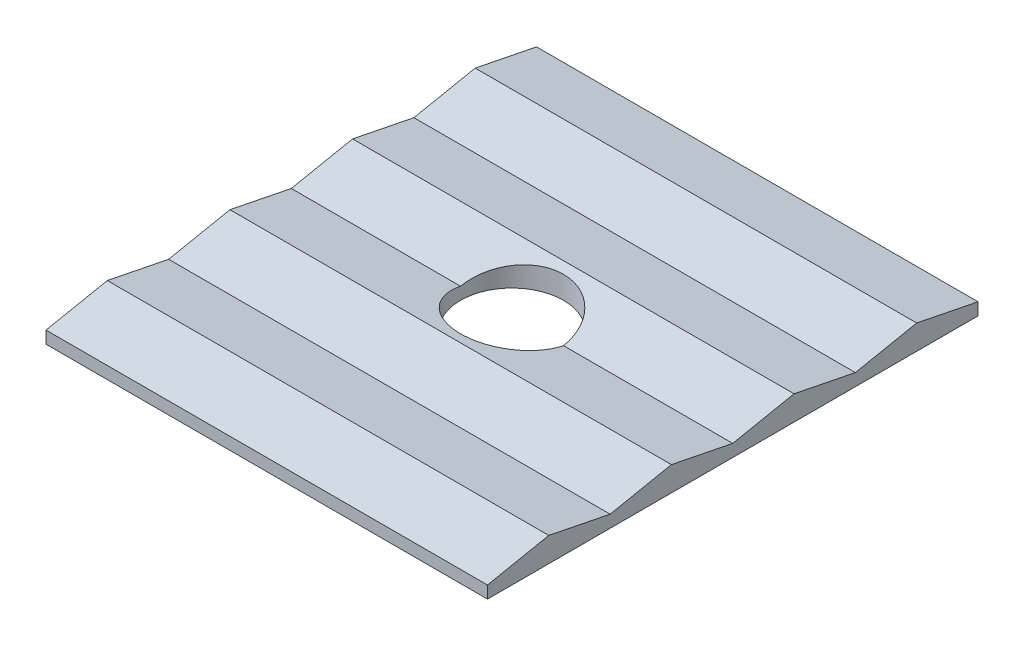
ISO-10303-21;
HEADER;
FILE_DESCRIPTION(('STEP AP214'),'2;1');
FILE_NAME('part.step','',(''),(''),'','','');
FILE_SCHEMA(('AUTOMOTIVE_DESIGN { 1 0 10303 214 1 1 1 1 }'));
ENDSEC;
DATA;
#1=APPLICATION_CONTEXT('core data for automotive mechanical design processes');
#2=APPLICATION_PROTOCOL_DEFINITION('international standard','automotive_design',2000,#1);
#3=PRODUCT_CONTEXT('',#1,'mechanical');
#4=PRODUCT('Part','Part','',(#3));
#5=PRODUCT_RELATED_PRODUCT_CATEGORY('part','',(#4));
#6=PRODUCT_DEFINITION_FORMATION('','',#4);
#7=PRODUCT_DEFINITION_CONTEXT('part definition',#1,'design');
#8=PRODUCT_DEFINITION('design','',#6,#7);
#9=PRODUCT_DEFINITION_SHAPE('','',#8);
#10=(LENGTH_UNIT() NAMED_UNIT(*) SI_UNIT(.MILLI.,.METRE.));
#11=(NAMED_UNIT(*) PLANE_ANGLE_UNIT() SI_UNIT($,.RADIAN.));
#12=(NAMED_UNIT(*) SI_UNIT($,.STERADIAN.) SOLID_ANGLE_UNIT());
#13=UNCERTAINTY_MEASURE_WITH_UNIT(LENGTH_MEASURE(1.E-05),#10,'distance_accuracy_value','');
#14=(GEOMETRIC_REPRESENTATION_CONTEXT(3) GLOBAL_UNCERTAINTY_ASSIGNED_CONTEXT((#13)) GLOBAL_UNIT_ASSIGNED_CONTEXT((#10,
#11,#12)) REPRESENTATION_CONTEXT('',''));
#15=CARTESIAN_POINT('',(0.,0.,0.));
#16=DIRECTION('',(0.,0.,1.));
#17=DIRECTION('',(1.,0.,0.));
#18=AXIS2_PLACEMENT_3D('',#15,#16,#17);
#19=CARTESIAN_POINT('',(22.86,0.,0.));
#20=DIRECTION('',(0.,0.,-1.));
#21=DIRECTION('',(-1.,0.,0.));
#22=AXIS2_PLACEMENT_3D('',#19,#20,#21);
#23=PLANE('',#22);
#24=DIRECTION('',(0.,-1.,0.));
#25=VECTOR('',#24,1.);
#26=CARTESIAN_POINT('',(0.,0.,0.));
#27=LINE('',#26,#25);
#28=CARTESIAN_POINT('',(0.,0.635,0.));
#29=VERTEX_POINT('',#28);
#30=CARTESIAN_POINT('',(0.,0.,0.));
#31=VERTEX_POINT('',#30);
#32=EDGE_CURVE('E174',#29,#31,#27,.T.);
#33=ORIENTED_EDGE('',*,*,#32,.T.);
#34=DIRECTION('',(-1.,0.,0.));
#35=VECTOR('',#34,1.);
#36=CARTESIAN_POINT('',(22.86,0.,0.));
#37=LINE('',#36,#35);
#38=CARTESIAN_POINT('',(22.86,0.,0.));
#39=VERTEX_POINT('',#38);
#40=EDGE_CURVE('E52',#39,#31,#37,.T.);
#41=ORIENTED_EDGE('',*,*,#40,.F.);
#42=DIRECTION('',(0.,-1.,0.));
#43=VECTOR('',#42,1.);
#44=CARTESIAN_POINT('',(22.86,0.,0.));
#45=LINE('',#44,#43);
#46=CARTESIAN_POINT('',(22.86,0.635,0.));
#47=VERTEX_POINT('',#46);
#48=EDGE_CURVE('E206',#47,#39,#45,.T.);
#49=ORIENTED_EDGE('',*,*,#48,.F.);
#50=DIRECTION('',(-1.,0.,0.));
#51=VECTOR('',#50,1.);
#52=CARTESIAN_POINT('',(22.86,0.635,0.));
#53=LINE('',#52,#51);
#54=EDGE_CURVE('E166',#47,#29,#53,.T.);
#55=ORIENTED_EDGE('',*,*,#54,.T.);
#56=EDGE_LOOP('',(#33,#41,#49,#55));
#57=FACE_BOUND('',#56,.T.);
#58=ADVANCED_FACE('F44',(#57),#23,.F.);
#59=CARTESIAN_POINT('',(22.86,0.,0.));
#60=DIRECTION('',(0.,1.,0.));
#61=DIRECTION('',(0.,0.,1.));
#62=AXIS2_PLACEMENT_3D('',#59,#60,#61);
#63=PLANE('',#62);
#64=CARTESIAN_POINT('',(11.43,0.,-12.7));
#65=DIRECTION('',(0.,-1.,0.));
#66=DIRECTION('',(0.,0.,-1.));
#67=AXIS2_PLACEMENT_3D('',#64,#65,#66);
#68=CIRCLE('',#67,2.667);
#69=CARTESIAN_POINT('',(11.43,0.,-15.367));
#70=VERTEX_POINT('',#69);
#71=EDGE_CURVE('E295',#70,#70,#68,.T.);
#72=ORIENTED_EDGE('',*,*,#71,.F.);
#73=EDGE_LOOP('',(#72));
#74=FACE_BOUND('',#73,.T.);
#75=DIRECTION('',(0.,0.,-1.));
#76=VECTOR('',#75,1.);
#77=CARTESIAN_POINT('',(0.,0.,0.));
#78=LINE('',#77,#76);
#79=CARTESIAN_POINT('',(0.,0.,-25.4));
#80=VERTEX_POINT('',#79);
#81=EDGE_CURVE('E179',#31,#80,#78,.T.);
#82=ORIENTED_EDGE('',*,*,#81,.T.);
#83=DIRECTION('',(-1.,0.,0.));
#84=VECTOR('',#83,1.);
#85=CARTESIAN_POINT('',(22.86,0.,-25.4));
#86=LINE('',#85,#84);
#87=CARTESIAN_POINT('',(22.86,0.,-25.4));
#88=VERTEX_POINT('',#87);
#89=EDGE_CURVE('E235',#88,#80,#86,.T.);
#90=ORIENTED_EDGE('',*,*,#89,.F.);
#91=DIRECTION('',(0.,0.,-1.));
#92=VECTOR('',#91,1.);
#93=CARTESIAN_POINT('',(22.86,0.,0.));
#94=LINE('',#93,#92);
#95=EDGE_CURVE('E119',#39,#88,#94,.T.);
#96=ORIENTED_EDGE('',*,*,#95,.F.);
#97=ORIENTED_EDGE('',*,*,#40,.T.);
#98=EDGE_LOOP('',(#82,#90,#96,#97));
#99=FACE_BOUND('',#98,.T.);
#100=ADVANCED_FACE('F239',(#74,#99),#63,.F.);
#101=CARTESIAN_POINT('',(22.86,0.,-25.4));
#102=DIRECTION('',(0.,0.,1.));
#103=DIRECTION('',(1.,0.,0.));
#104=AXIS2_PLACEMENT_3D('',#101,#102,#103);
#105=PLANE('',#104);
#106=DIRECTION('',(0.,1.,0.));
#107=VECTOR('',#106,1.);
#108=CARTESIAN_POINT('',(0.,0.,-25.4));
#109=LINE('',#108,#107);
#110=CARTESIAN_POINT('',(0.,0.635,-25.4));
#111=VERTEX_POINT('',#110);
#112=EDGE_CURVE('E176',#80,#111,#109,.T.);
#113=ORIENTED_EDGE('',*,*,#112,.T.);
#114=DIRECTION('',(-1.,0.,0.));
#115=VECTOR('',#114,1.);
#116=CARTESIAN_POINT('',(22.86,0.635,-25.4));
#117=LINE('',#116,#115);
#118=CARTESIAN_POINT('',(22.86,0.635,-25.4));
#119=VERTEX_POINT('',#118);
#120=EDGE_CURVE('E228',#119,#111,#117,.T.);
#121=ORIENTED_EDGE('',*,*,#120,.F.);
#122=DIRECTION('',(0.,1.,0.));
#123=VECTOR('',#122,1.);
#124=CARTESIAN_POINT('',(22.86,0.,-25.4));
#125=LINE('',#124,#123);
#126=EDGE_CURVE('E257',#88,#119,#125,.T.);
#127=ORIENTED_EDGE('',*,*,#126,.F.);
#128=ORIENTED_EDGE('',*,*,#89,.T.);
#129=EDGE_LOOP('',(#113,#121,#127,#128));
#130=FACE_BOUND('',#129,.T.);
#131=ADVANCED_FACE('F246',(#130),#105,.F.);
#132=CARTESIAN_POINT('',(22.86,1.27,-22.225));
#133=DIRECTION('',(0.,-0.98058067569092,0.196116135138184));
#134=DIRECTION('',(0.,-0.196116135138184,-0.98058067569092));
#135=AXIS2_PLACEMENT_3D('',#132,#133,#134);
#136=PLANE('',#135);
#137=DIRECTION('',(0.,0.196116135138184,0.98058067569092));
#138=VECTOR('',#137,1.);
#139=CARTESIAN_POINT('',(0.,1.27,-22.225));
#140=LINE('',#139,#138);
#141=CARTESIAN_POINT('',(0.,1.27,-22.225));
#142=VERTEX_POINT('',#141);
#143=EDGE_CURVE('E181',#111,#142,#140,.T.);
#144=ORIENTED_EDGE('',*,*,#143,.T.);
#145=DIRECTION('',(-1.,0.,0.));
#146=VECTOR('',#145,1.);
#147=CARTESIAN_POINT('',(22.86,1.27,-22.225));
#148=LINE('',#147,#146);
#149=CARTESIAN_POINT('',(22.86,1.27,-22.225));
#150=VERTEX_POINT('',#149);
#151=EDGE_CURVE('E227',#150,#142,#148,.T.);
#152=ORIENTED_EDGE('',*,*,#151,.F.);
#153=DIRECTION('',(0.,0.196116135138184,0.98058067569092));
#154=VECTOR('',#153,1.);
#155=CARTESIAN_POINT('',(22.86,1.27,-22.225));
#156=LINE('',#155,#154);
#157=EDGE_CURVE('E258',#119,#150,#156,.T.);
#158=ORIENTED_EDGE('',*,*,#157,.F.);
#159=ORIENTED_EDGE('',*,*,#120,.T.);
#160=EDGE_LOOP('',(#144,#152,#158,#159));
#161=FACE_BOUND('',#160,.T.);
#162=ADVANCED_FACE('F255',(#161),#136,.F.);
#163=CARTESIAN_POINT('',(22.86,0.635,-19.05));
#164=DIRECTION('',(0.,-0.98058067569092,-0.196116135138184));
#165=DIRECTION('',(0.,0.196116135138184,-0.98058067569092));
#166=AXIS2_PLACEMENT_3D('',#163,#164,#165);
#167=PLANE('',#166);
#168=DIRECTION('',(0.,-0.196116135138184,0.98058067569092));
#169=VECTOR('',#168,1.);
#170=CARTESIAN_POINT('',(0.,0.635,-19.05));
#171=LINE('',#170,#169);
#172=CARTESIAN_POINT('',(0.,0.635,-19.05));
#173=VERTEX_POINT('',#172);
#174=EDGE_CURVE('E187',#142,#173,#171,.T.);
#175=ORIENTED_EDGE('',*,*,#174,.T.);
#176=DIRECTION('',(-1.,0.,0.));
#177=VECTOR('',#176,1.);
#178=CARTESIAN_POINT('',(22.86,0.635,-19.05));
#179=LINE('',#178,#177);
#180=CARTESIAN_POINT('',(22.86,0.635,-19.05));
#181=VERTEX_POINT('',#180);
#182=EDGE_CURVE('E225',#181,#173,#179,.T.);
#183=ORIENTED_EDGE('',*,*,#182,.F.);
#184=DIRECTION('',(0.,-0.196116135138184,0.98058067569092));
#185=VECTOR('',#184,1.);
#186=CARTESIAN_POINT('',(22.86,0.635,-19.05));
#187=LINE('',#186,#185);
#188=EDGE_CURVE('E259',#150,#181,#187,.T.);
#189=ORIENTED_EDGE('',*,*,#188,.F.);
#190=ORIENTED_EDGE('',*,*,#151,.T.);
#191=EDGE_LOOP('',(#175,#183,#189,#190));
#192=FACE_BOUND('',#191,.T.);
#193=ADVANCED_FACE('F309',(#192),#167,.F.);
#194=CARTESIAN_POINT('',(22.86,1.27,-15.875));
#195=DIRECTION('',(0.,-0.98058067569092,0.196116135138184));
#196=DIRECTION('',(0.,-0.196116135138184,-0.98058067569092));
#197=AXIS2_PLACEMENT_3D('',#194,#195,#196);
#198=PLANE('',#197);
#199=DIRECTION('',(0.,0.196116135138184,0.98058067569092));
#200=VECTOR('',#199,1.);
#201=CARTESIAN_POINT('',(0.,1.27,-15.875));
#202=LINE('',#201,#200);
#203=CARTESIAN_POINT('',(0.,1.27,-15.875));
#204=VERTEX_POINT('',#203);
#205=EDGE_CURVE('E186',#173,#204,#202,.T.);
#206=ORIENTED_EDGE('',*,*,#205,.T.);
#207=DIRECTION('',(-1.,0.,0.));
#208=VECTOR('',#207,1.);
#209=CARTESIAN_POINT('',(22.86,1.27,-15.875));
#210=LINE('',#209,#208);
#211=CARTESIAN_POINT('',(22.86,1.27,-15.875));
#212=VERTEX_POINT('',#211);
#213=EDGE_CURVE('E217',#212,#204,#210,.T.);
#214=ORIENTED_EDGE('',*,*,#213,.F.);
#215=DIRECTION('',(0.,0.196116135138184,0.98058067569092));
#216=VECTOR('',#215,1.);
#217=CARTESIAN_POINT('',(22.86,1.27,-15.875));
#218=LINE('',#217,#216);
#219=EDGE_CURVE('E262',#181,#212,#218,.T.);
#220=ORIENTED_EDGE('',*,*,#219,.F.);
#221=ORIENTED_EDGE('',*,*,#182,.T.);
#222=EDGE_LOOP('',(#206,#214,#220,#221));
#223=FACE_BOUND('',#222,.T.);
#224=ADVANCED_FACE('F311',(#223),#198,.F.);
#225=CARTESIAN_POINT('',(22.86,0.635,-12.7));
#226=DIRECTION('',(0.,-0.98058067569092,-0.196116135138184));
#227=DIRECTION('',(0.,0.196116135138184,-0.98058067569092));
#228=AXIS2_PLACEMENT_3D('',#225,#226,#227);
#229=PLANE('',#228);
#230=DIRECTION('',(-1.,0.,0.));
#231=VECTOR('',#230,1.);
#232=CARTESIAN_POINT('',(22.86,0.635,-12.7));
#233=LINE('',#232,#231);
#234=CARTESIAN_POINT('',(8.76300000000001,0.635,-12.7));
#235=VERTEX_POINT('',#234);
#236=CARTESIAN_POINT('',(0.,0.635,-12.7));
#237=VERTEX_POINT('',#236);
#238=EDGE_CURVE('E213',#235,#237,#233,.T.);
#239=ORIENTED_EDGE('',*,*,#238,.F.);
#240=CARTESIAN_POINT('',(11.43,0.635,-12.7));
#241=DIRECTION('',(0.,-0.98058067569092,-0.196116135138184));
#242=DIRECTION('',(0.,-0.196116135138184,0.98058067569092));
#243=AXIS2_PLACEMENT_3D('',#240,#241,#242);
#244=ELLIPSE('',#243,2.71981700855039,2.667);
#245=CARTESIAN_POINT('',(14.097,0.635,-12.7));
#246=VERTEX_POINT('',#245);
#247=EDGE_CURVE('E56',#235,#246,#244,.T.);
#248=ORIENTED_EDGE('',*,*,#247,.T.);
#249=CARTESIAN_POINT('',(22.86,0.635,-12.7));
#250=VERTEX_POINT('',#249);
#251=EDGE_CURVE('E212',#250,#246,#233,.T.);
#252=ORIENTED_EDGE('',*,*,#251,.F.);
#253=DIRECTION('',(0.,-0.196116135138184,0.98058067569092));
#254=VECTOR('',#253,1.);
#255=CARTESIAN_POINT('',(22.86,0.635,-12.7));
#256=LINE('',#255,#254);
#257=EDGE_CURVE('E271',#212,#250,#256,.T.);
#258=ORIENTED_EDGE('',*,*,#257,.F.);
#259=ORIENTED_EDGE('',*,*,#213,.T.);
#260=DIRECTION('',(0.,-0.196116135138184,0.98058067569092));
#261=VECTOR('',#260,1.);
#262=CARTESIAN_POINT('',(0.,0.635,-12.7));
#263=LINE('',#262,#261);
#264=EDGE_CURVE('E194',#204,#237,#263,.T.);
#265=ORIENTED_EDGE('',*,*,#264,.T.);
#266=EDGE_LOOP('',(#239,#248,#252,#258,#259,#265));
#267=FACE_BOUND('',#266,.T.);
#268=ADVANCED_FACE('F278',(#267),#229,.F.);
#269=CARTESIAN_POINT('',(22.86,1.27,-9.525));
#270=DIRECTION('',(0.,-0.98058067569092,0.196116135138184));
#271=DIRECTION('',(0.,-0.196116135138184,-0.98058067569092));
#272=AXIS2_PLACEMENT_3D('',#269,#270,#271);
#273=PLANE('',#272);
#274=ORIENTED_EDGE('',*,*,#251,.T.);
#275=CARTESIAN_POINT('',(11.43,0.635,-12.7));
#276=DIRECTION('',(0.,-0.98058067569092,0.196116135138184));
#277=DIRECTION('',(0.,-0.196116135138184,-0.98058067569092));
#278=AXIS2_PLACEMENT_3D('',#275,#276,#277);
#279=ELLIPSE('',#278,2.71981700855039,2.667);
#280=EDGE_CURVE('E11',#246,#235,#279,.T.);
#281=ORIENTED_EDGE('',*,*,#280,.T.);
#282=ORIENTED_EDGE('',*,*,#238,.T.);
#283=DIRECTION('',(0.,0.196116135138184,0.98058067569092));
#284=VECTOR('',#283,1.);
#285=CARTESIAN_POINT('',(0.,1.27,-9.525));
#286=LINE('',#285,#284);
#287=CARTESIAN_POINT('',(0.,1.27,-9.525));
#288=VERTEX_POINT('',#287);
#289=EDGE_CURVE('E198',#237,#288,#286,.T.);
#290=ORIENTED_EDGE('',*,*,#289,.T.);
#291=DIRECTION('',(-1.,0.,0.));
#292=VECTOR('',#291,1.);
#293=CARTESIAN_POINT('',(22.86,1.27,-9.525));
#294=LINE('',#293,#292);
#295=CARTESIAN_POINT('',(22.86,1.27,-9.525));
#296=VERTEX_POINT('',#295);
#297=EDGE_CURVE('E165',#296,#288,#294,.T.);
#298=ORIENTED_EDGE('',*,*,#297,.F.);
#299=DIRECTION('',(0.,0.196116135138184,0.98058067569092));
#300=VECTOR('',#299,1.);
#301=CARTESIAN_POINT('',(22.86,1.27,-9.525));
#302=LINE('',#301,#300);
#303=EDGE_CURVE('E146',#250,#296,#302,.T.);
#304=ORIENTED_EDGE('',*,*,#303,.F.);
#305=EDGE_LOOP('',(#274,#281,#282,#290,#298,#304));
#306=FACE_BOUND('',#305,.T.);
#307=ADVANCED_FACE('F285',(#306),#273,.F.);
#308=CARTESIAN_POINT('',(22.86,0.635,-6.35));
#309=DIRECTION('',(0.,-0.98058067569092,-0.196116135138184));
#310=DIRECTION('',(0.,0.196116135138184,-0.98058067569092));
#311=AXIS2_PLACEMENT_3D('',#308,#309,#310);
#312=PLANE('',#311);
#313=DIRECTION('',(0.,-0.196116135138184,0.98058067569092));
#314=VECTOR('',#313,1.);
#315=CARTESIAN_POINT('',(0.,0.635,-6.35));
#316=LINE('',#315,#314);
#317=CARTESIAN_POINT('',(0.,0.635,-6.35));
#318=VERTEX_POINT('',#317);
#319=EDGE_CURVE('E158',#288,#318,#316,.T.);
#320=ORIENTED_EDGE('',*,*,#319,.T.);
#321=DIRECTION('',(-1.,0.,0.));
#322=VECTOR('',#321,1.);
#323=CARTESIAN_POINT('',(22.86,0.635,-6.35));
#324=LINE('',#323,#322);
#325=CARTESIAN_POINT('',(22.86,0.635,-6.35));
#326=VERTEX_POINT('',#325);
#327=EDGE_CURVE('E154',#326,#318,#324,.T.);
#328=ORIENTED_EDGE('',*,*,#327,.F.);
#329=DIRECTION('',(0.,-0.196116135138184,0.98058067569092));
#330=VECTOR('',#329,1.);
#331=CARTESIAN_POINT('',(22.86,0.635,-6.35));
#332=LINE('',#331,#330);
#333=EDGE_CURVE('E143',#296,#326,#332,.T.);
#334=ORIENTED_EDGE('',*,*,#333,.F.);
#335=ORIENTED_EDGE('',*,*,#297,.T.);
#336=EDGE_LOOP('',(#320,#328,#334,#335));
#337=FACE_BOUND('',#336,.T.);
#338=ADVANCED_FACE('F156',(#337),#312,.F.);
#339=CARTESIAN_POINT('',(22.86,1.27,-3.175));
#340=DIRECTION('',(0.,-0.98058067569092,0.196116135138184));
#341=DIRECTION('',(0.,-0.196116135138184,-0.98058067569092));
#342=AXIS2_PLACEMENT_3D('',#339,#340,#341);
#343=PLANE('',#342);
#344=DIRECTION('',(0.,0.196116135138184,0.98058067569092));
#345=VECTOR('',#344,1.);
#346=CARTESIAN_POINT('',(0.,1.27,-3.175));
#347=LINE('',#346,#345);
#348=CARTESIAN_POINT('',(0.,1.27,-3.175));
#349=VERTEX_POINT('',#348);
#350=EDGE_CURVE('E203',#318,#349,#347,.T.);
#351=ORIENTED_EDGE('',*,*,#350,.T.);
#352=DIRECTION('',(-1.,0.,0.));
#353=VECTOR('',#352,1.);
#354=CARTESIAN_POINT('',(22.86,1.27,-3.175));
#355=LINE('',#354,#353);
#356=CARTESIAN_POINT('',(22.86,1.27,-3.175));
#357=VERTEX_POINT('',#356);
#358=EDGE_CURVE('E162',#357,#349,#355,.T.);
#359=ORIENTED_EDGE('',*,*,#358,.F.);
#360=DIRECTION('',(0.,0.196116135138184,0.98058067569092));
#361=VECTOR('',#360,1.);
#362=CARTESIAN_POINT('',(22.86,1.27,-3.175));
#363=LINE('',#362,#361);
#364=EDGE_CURVE('E144',#326,#357,#363,.T.);
#365=ORIENTED_EDGE('',*,*,#364,.F.);
#366=ORIENTED_EDGE('',*,*,#327,.T.);
#367=EDGE_LOOP('',(#351,#359,#365,#366));
#368=FACE_BOUND('',#367,.T.);
#369=ADVANCED_FACE('F164',(#368),#343,.F.);
#370=CARTESIAN_POINT('',(22.86,0.635,0.));
#371=DIRECTION('',(0.,-0.98058067569092,-0.196116135138184));
#372=DIRECTION('',(0.,0.196116135138184,-0.98058067569092));
#373=AXIS2_PLACEMENT_3D('',#370,#371,#372);
#374=PLANE('',#373);
#375=DIRECTION('',(0.,-0.196116135138184,0.98058067569092));
#376=VECTOR('',#375,1.);
#377=CARTESIAN_POINT('',(0.,0.635,0.));
#378=LINE('',#377,#376);
#379=EDGE_CURVE('E108',#349,#29,#378,.T.);
#380=ORIENTED_EDGE('',*,*,#379,.T.);
#381=ORIENTED_EDGE('',*,*,#54,.F.);
#382=DIRECTION('',(0.,-0.196116135138184,0.98058067569092));
#383=VECTOR('',#382,1.);
#384=CARTESIAN_POINT('',(22.86,0.635,0.));
#385=LINE('',#384,#383);
#386=EDGE_CURVE('E69',#357,#47,#385,.T.);
#387=ORIENTED_EDGE('',*,*,#386,.F.);
#388=ORIENTED_EDGE('',*,*,#358,.T.);
#389=EDGE_LOOP('',(#380,#381,#387,#388));
#390=FACE_BOUND('',#389,.T.);
#391=ADVANCED_FACE('F283',(#390),#374,.F.);
#392=CARTESIAN_POINT('',(22.86,0.,0.));
#393=DIRECTION('',(-1.,0.,0.));
#394=DIRECTION('',(0.,0.,1.));
#395=AXIS2_PLACEMENT_3D('',#392,#393,#394);
#396=PLANE('',#395);
#397=ORIENTED_EDGE('',*,*,#48,.T.);
#398=ORIENTED_EDGE('',*,*,#95,.T.);
#399=ORIENTED_EDGE('',*,*,#126,.T.);
#400=ORIENTED_EDGE('',*,*,#157,.T.);
#401=ORIENTED_EDGE('',*,*,#188,.T.);
#402=ORIENTED_EDGE('',*,*,#219,.T.);
#403=ORIENTED_EDGE('',*,*,#257,.T.);
#404=ORIENTED_EDGE('',*,*,#303,.T.);
#405=ORIENTED_EDGE('',*,*,#333,.T.);
#406=ORIENTED_EDGE('',*,*,#364,.T.);
#407=ORIENTED_EDGE('',*,*,#386,.T.);
#408=EDGE_LOOP('',(#397,#398,#399,#400,#401,#402,#403,#404,#405,#406,#407));
#409=FACE_BOUND('',#408,.T.);
#410=ADVANCED_FACE('F141',(#409),#396,.F.);
#411=CARTESIAN_POINT('',(0.,0.,0.));
#412=DIRECTION('',(-1.,0.,0.));
#413=DIRECTION('',(0.,0.,1.));
#414=AXIS2_PLACEMENT_3D('',#411,#412,#413);
#415=PLANE('',#414);
#416=ORIENTED_EDGE('',*,*,#32,.F.);
#417=ORIENTED_EDGE('',*,*,#379,.F.);
#418=ORIENTED_EDGE('',*,*,#350,.F.);
#419=ORIENTED_EDGE('',*,*,#319,.F.);
#420=ORIENTED_EDGE('',*,*,#289,.F.);
#421=ORIENTED_EDGE('',*,*,#264,.F.);
#422=ORIENTED_EDGE('',*,*,#205,.F.);
#423=ORIENTED_EDGE('',*,*,#174,.F.);
#424=ORIENTED_EDGE('',*,*,#143,.F.);
#425=ORIENTED_EDGE('',*,*,#112,.F.);
#426=ORIENTED_EDGE('',*,*,#81,.F.);
#427=EDGE_LOOP('',(#416,#417,#418,#419,#420,#421,#422,#423,#424,#425,#426));
#428=FACE_BOUND('',#427,.T.);
#429=ADVANCED_FACE('F241',(#428),#415,.T.);
#430=CARTESIAN_POINT('',(11.43,22.86,-12.7));
#431=DIRECTION('',(0.,-1.,0.));
#432=DIRECTION('',(0.,0.,-1.));
#433=AXIS2_PLACEMENT_3D('',#430,#431,#432);
#434=CYLINDRICAL_SURFACE('',#433,2.667);
#435=ORIENTED_EDGE('',*,*,#71,.T.);
#436=EDGE_LOOP('',(#435));
#437=FACE_BOUND('',#436,.T.);
#438=ORIENTED_EDGE('',*,*,#280,.F.);
#439=ORIENTED_EDGE('',*,*,#247,.F.);
#440=EDGE_LOOP('',(#438,#439));
#441=FACE_BOUND('',#440,.T.);
#442=ADVANCED_FACE('F300',(#437,#441),#434,.F.);
#443=CLOSED_SHELL('',(#58,#100,#131,#162,#193,#224,#268,#307,#338,#369,#391,#410,#429,#442));
#444=MANIFOLD_SOLID_BREP('B2',#443);
#445=ADVANCED_BREP_SHAPE_REPRESENTATION('',(#18,#444),#14);
#446=SHAPE_DEFINITION_REPRESENTATION(#9,#445);
ENDSEC;
END-ISO-10303-21;
